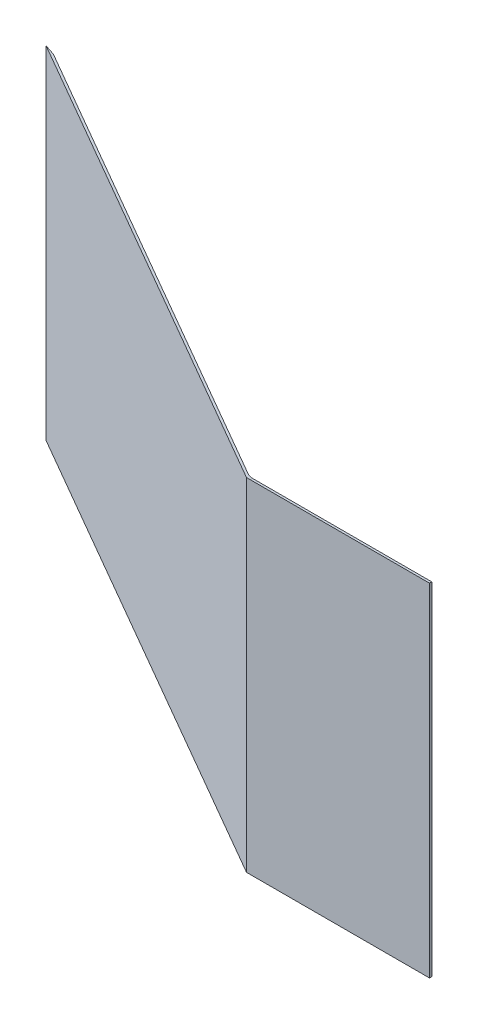
ISO-10303-21;
HEADER;
FILE_DESCRIPTION(('STEP AP214'),'2;1');
FILE_NAME('part.step','',(''),(''),'','','');
FILE_SCHEMA(('AUTOMOTIVE_DESIGN { 1 0 10303 214 1 1 1 1 }'));
ENDSEC;
DATA;
#1=APPLICATION_CONTEXT('core data for automotive mechanical design processes');
#2=APPLICATION_PROTOCOL_DEFINITION('international standard','automotive_design',2000,#1);
#3=PRODUCT_CONTEXT('',#1,'mechanical');
#4=PRODUCT('Part','Part','',(#3));
#5=PRODUCT_RELATED_PRODUCT_CATEGORY('part','',(#4));
#6=PRODUCT_DEFINITION_FORMATION('','',#4);
#7=PRODUCT_DEFINITION_CONTEXT('part definition',#1,'design');
#8=PRODUCT_DEFINITION('design','',#6,#7);
#9=PRODUCT_DEFINITION_SHAPE('','',#8);
#10=(LENGTH_UNIT() NAMED_UNIT(*) SI_UNIT(.MILLI.,.METRE.));
#11=(NAMED_UNIT(*) PLANE_ANGLE_UNIT() SI_UNIT($,.RADIAN.));
#12=(NAMED_UNIT(*) SI_UNIT($,.STERADIAN.) SOLID_ANGLE_UNIT());
#13=UNCERTAINTY_MEASURE_WITH_UNIT(LENGTH_MEASURE(1.E-05),#10,'distance_accuracy_value','');
#14=(GEOMETRIC_REPRESENTATION_CONTEXT(3) GLOBAL_UNCERTAINTY_ASSIGNED_CONTEXT((#13)) GLOBAL_UNIT_ASSIGNED_CONTEXT((#10,
#11,#12)) REPRESENTATION_CONTEXT('',''));
#15=CARTESIAN_POINT('',(0.,0.,0.));
#16=DIRECTION('',(0.,0.,1.));
#17=DIRECTION('',(1.,0.,0.));
#18=AXIS2_PLACEMENT_3D('',#15,#16,#17);
#19=CARTESIAN_POINT('',(118.585450177388,10.,41.1577708137846));
#20=DIRECTION('',(0.,0.,1.));
#21=DIRECTION('',(1.,0.,0.));
#22=AXIS2_PLACEMENT_3D('',#19,#20,#21);
#23=PLANE('',#22);
#24=DIRECTION('',(-1.,0.,0.));
#25=VECTOR('',#24,1.);
#26=CARTESIAN_POINT('',(118.585450177388,0.,41.1577708137846));
#27=LINE('',#26,#25);
#28=CARTESIAN_POINT('',(198.585450177388,0.,41.1577708137846));
#29=VERTEX_POINT('',#28);
#30=CARTESIAN_POINT('',(119.925196139544,0.,41.1577708137846));
#31=VERTEX_POINT('',#30);
#32=EDGE_CURVE('E133',#29,#31,#27,.T.);
#33=ORIENTED_EDGE('',*,*,#32,.T.);
#34=DIRECTION('',(0.,-1.,0.));
#35=VECTOR('',#34,1.);
#36=CARTESIAN_POINT('',(119.925196139544,150.,41.1577708137846));
#37=LINE('',#36,#35);
#38=CARTESIAN_POINT('',(119.925196139544,150.,41.1577708137846));
#39=VERTEX_POINT('',#38);
#40=EDGE_CURVE('E49',#31,#39,#37,.F.);
#41=ORIENTED_EDGE('',*,*,#40,.T.);
#42=DIRECTION('',(-1.,0.,0.));
#43=VECTOR('',#42,1.);
#44=CARTESIAN_POINT('',(118.585450177388,150.,41.1577708137846));
#45=LINE('',#44,#43);
#46=CARTESIAN_POINT('',(198.585450177388,150.,41.1577708137846));
#47=VERTEX_POINT('',#46);
#48=EDGE_CURVE('E275',#47,#39,#45,.T.);
#49=ORIENTED_EDGE('',*,*,#48,.F.);
#50=DIRECTION('',(0.,-1.,0.));
#51=VECTOR('',#50,1.);
#52=CARTESIAN_POINT('',(198.585450177388,10.,41.1577708137846));
#53=LINE('',#52,#51);
#54=EDGE_CURVE('E144',#47,#29,#53,.T.);
#55=ORIENTED_EDGE('',*,*,#54,.T.);
#56=EDGE_LOOP('',(#33,#41,#49,#55));
#57=FACE_BOUND('',#56,.T.);
#58=ADVANCED_FACE('F34',(#57),#23,.F.);
#59=CARTESIAN_POINT('',(-84.9305197119548,10.,-76.3422291862157));
#60=DIRECTION('',(-0.500000000000001,0.,0.866025403784438));
#61=DIRECTION('',(0.866025403784438,0.,0.500000000000001));
#62=AXIS2_PLACEMENT_3D('',#59,#60,#61);
#63=PLANE('',#62);
#64=DIRECTION('',(-0.866025403784438,0.,-0.500000000000001));
#65=VECTOR('',#64,1.);
#66=CARTESIAN_POINT('',(-84.9305197119548,150.,-76.3422291862157));
#67=LINE('',#66,#65);
#68=CARTESIAN_POINT('',(117.425196139544,150.,40.4878978327068));
#69=VERTEX_POINT('',#68);
#70=CARTESIAN_POINT('',(-84.4779851204287,150.,-76.0809582179805));
#71=VERTEX_POINT('',#70);
#72=EDGE_CURVE('E111',#69,#71,#67,.T.);
#73=ORIENTED_EDGE('',*,*,#72,.F.);
#74=DIRECTION('',(0.,-1.,0.));
#75=VECTOR('',#74,1.);
#76=CARTESIAN_POINT('',(117.425196139544,0.,40.4878978327068));
#77=LINE('',#76,#75);
#78=CARTESIAN_POINT('',(117.425196139544,0.,40.4878978327068));
#79=VERTEX_POINT('',#78);
#80=EDGE_CURVE('E159',#69,#79,#77,.T.);
#81=ORIENTED_EDGE('',*,*,#80,.T.);
#82=DIRECTION('',(-0.866025403784438,0.,-0.500000000000001));
#83=VECTOR('',#82,1.);
#84=CARTESIAN_POINT('',(-84.9305197119548,0.,-76.3422291862157));
#85=LINE('',#84,#83);
#86=CARTESIAN_POINT('',(-84.4779851204287,0.,-76.0809582179805));
#87=VERTEX_POINT('',#86);
#88=EDGE_CURVE('E135',#79,#87,#85,.T.);
#89=ORIENTED_EDGE('',*,*,#88,.T.);
#90=DIRECTION('',(0.,-1.,0.));
#91=VECTOR('',#90,1.);
#92=CARTESIAN_POINT('',(-84.4779851204287,10.,-76.0809582179805));
#93=LINE('',#92,#91);
#94=EDGE_CURVE('E155',#87,#71,#93,.F.);
#95=ORIENTED_EDGE('',*,*,#94,.T.);
#96=EDGE_LOOP('',(#73,#81,#89,#95));
#97=FACE_BOUND('',#96,.T.);
#98=ADVANCED_FACE('F165',(#97),#63,.F.);
#99=CARTESIAN_POINT('',(-89.5285959233081,10.,-77.8422291862156));
#100=DIRECTION('',(-0.310137835507767,0.,0.950691602459261));
#101=DIRECTION('',(0.950691602459261,0.,0.310137835507767));
#102=AXIS2_PLACEMENT_3D('',#99,#100,#101);
#103=PLANE('',#102);
#104=DIRECTION('',(-0.950691602459261,0.,-0.310137835507767));
#105=VECTOR('',#104,1.);
#106=CARTESIAN_POINT('',(-89.5285959233081,150.,-77.8422291862156));
#107=LINE('',#106,#105);
#108=CARTESIAN_POINT('',(-85.4272959428899,150.,-76.5042892113546));
#109=VERTEX_POINT('',#108);
#110=CARTESIAN_POINT('',(-89.5285959233081,150.,-77.8422291862156));
#111=VERTEX_POINT('',#110);
#112=EDGE_CURVE('E99',#109,#111,#107,.T.);
#113=ORIENTED_EDGE('',*,*,#112,.F.);
#114=DIRECTION('',(0.,-1.,0.));
#115=VECTOR('',#114,1.);
#116=CARTESIAN_POINT('',(-85.4272959428899,10.,-76.5042892113546));
#117=LINE('',#116,#115);
#118=CARTESIAN_POINT('',(-85.4272959428899,0.,-76.5042892113546));
#119=VERTEX_POINT('',#118);
#120=EDGE_CURVE('E120',#109,#119,#117,.T.);
#121=ORIENTED_EDGE('',*,*,#120,.T.);
#122=DIRECTION('',(-0.950691602459261,0.,-0.310137835507767));
#123=VECTOR('',#122,1.);
#124=CARTESIAN_POINT('',(-89.5285959233081,0.,-77.8422291862156));
#125=LINE('',#124,#123);
#126=CARTESIAN_POINT('',(-89.5285959233081,0.,-77.8422291862156));
#127=VERTEX_POINT('',#126);
#128=EDGE_CURVE('E117',#119,#127,#125,.T.);
#129=ORIENTED_EDGE('',*,*,#128,.T.);
#130=DIRECTION('',(0.,-1.,0.));
#131=VECTOR('',#130,1.);
#132=CARTESIAN_POINT('',(-89.5285959233081,10.,-77.8422291862156));
#133=LINE('',#132,#131);
#134=EDGE_CURVE('E114',#111,#127,#133,.T.);
#135=ORIENTED_EDGE('',*,*,#134,.F.);
#136=EDGE_LOOP('',(#113,#121,#129,#135));
#137=FACE_BOUND('',#136,.T.);
#138=ADVANCED_FACE('F115',(#137),#103,.F.);
#139=CARTESIAN_POINT('',(-89.5285959233081,10.,-77.8422291862156));
#140=DIRECTION('',(0.500000000000001,0.,-0.866025403784438));
#141=DIRECTION('',(-0.866025403784438,0.,-0.500000000000001));
#142=AXIS2_PLACEMENT_3D('',#139,#140,#141);
#143=PLANE('',#142);
#144=DIRECTION('',(0.866025403784438,0.,0.500000000000001));
#145=VECTOR('',#144,1.);
#146=CARTESIAN_POINT('',(-89.5285959233081,0.,-77.8422291862156));
#147=LINE('',#146,#145);
#148=CARTESIAN_POINT('',(118.317500984957,0.,42.1577708137846));
#149=VERTEX_POINT('',#148);
#150=EDGE_CURVE('E138',#127,#149,#147,.T.);
#151=ORIENTED_EDGE('',*,*,#150,.T.);
#152=DIRECTION('',(0.,-1.,0.));
#153=VECTOR('',#152,1.);
#154=CARTESIAN_POINT('',(118.317500984957,10.,42.1577708137846));
#155=LINE('',#154,#153);
#156=CARTESIAN_POINT('',(118.317500984957,150.,42.1577708137846));
#157=VERTEX_POINT('',#156);
#158=EDGE_CURVE('E121',#157,#149,#155,.T.);
#159=ORIENTED_EDGE('',*,*,#158,.F.);
#160=DIRECTION('',(0.866025403784438,0.,0.500000000000001));
#161=VECTOR('',#160,1.);
#162=CARTESIAN_POINT('',(-89.5285959233081,150.,-77.8422291862156));
#163=LINE('',#162,#161);
#164=EDGE_CURVE('E104',#111,#157,#163,.T.);
#165=ORIENTED_EDGE('',*,*,#164,.F.);
#166=ORIENTED_EDGE('',*,*,#134,.T.);
#167=EDGE_LOOP('',(#151,#159,#165,#166));
#168=FACE_BOUND('',#167,.T.);
#169=ADVANCED_FACE('F123',(#168),#143,.F.);
#170=CARTESIAN_POINT('',(118.317500984957,10.,42.1577708137846));
#171=DIRECTION('',(0.,0.,-1.));
#172=DIRECTION('',(-1.,0.,0.));
#173=AXIS2_PLACEMENT_3D('',#170,#171,#172);
#174=PLANE('',#173);
#175=DIRECTION('',(1.,0.,0.));
#176=VECTOR('',#175,1.);
#177=CARTESIAN_POINT('',(118.317500984957,0.,42.1577708137846));
#178=LINE('',#177,#176);
#179=CARTESIAN_POINT('',(198.585450177388,0.,42.1577708137846));
#180=VERTEX_POINT('',#179);
#181=EDGE_CURVE('E140',#149,#180,#178,.T.);
#182=ORIENTED_EDGE('',*,*,#181,.T.);
#183=DIRECTION('',(0.,-1.,0.));
#184=VECTOR('',#183,1.);
#185=CARTESIAN_POINT('',(198.585450177388,10.,42.1577708137846));
#186=LINE('',#185,#184);
#187=CARTESIAN_POINT('',(198.585450177388,150.,42.1577708137846));
#188=VERTEX_POINT('',#187);
#189=EDGE_CURVE('E147',#188,#180,#186,.T.);
#190=ORIENTED_EDGE('',*,*,#189,.F.);
#191=DIRECTION('',(1.,0.,0.));
#192=VECTOR('',#191,1.);
#193=CARTESIAN_POINT('',(118.317500984957,150.,42.1577708137846));
#194=LINE('',#193,#192);
#195=EDGE_CURVE('E125',#157,#188,#194,.T.);
#196=ORIENTED_EDGE('',*,*,#195,.F.);
#197=ORIENTED_EDGE('',*,*,#158,.T.);
#198=EDGE_LOOP('',(#182,#190,#196,#197));
#199=FACE_BOUND('',#198,.T.);
#200=ADVANCED_FACE('F189',(#199),#174,.F.);
#201=CARTESIAN_POINT('',(198.585450177388,10.,41.1577708137846));
#202=DIRECTION('',(-1.,0.,0.));
#203=DIRECTION('',(0.,0.,1.));
#204=AXIS2_PLACEMENT_3D('',#201,#202,#203);
#205=PLANE('',#204);
#206=DIRECTION('',(0.,0.,-1.));
#207=VECTOR('',#206,1.);
#208=CARTESIAN_POINT('',(198.585450177388,0.,41.1577708137846));
#209=LINE('',#208,#207);
#210=EDGE_CURVE('E142',#180,#29,#209,.T.);
#211=ORIENTED_EDGE('',*,*,#210,.T.);
#212=ORIENTED_EDGE('',*,*,#54,.F.);
#213=DIRECTION('',(0.,0.,-1.));
#214=VECTOR('',#213,1.);
#215=CARTESIAN_POINT('',(198.585450177388,150.,41.1577708137846));
#216=LINE('',#215,#214);
#217=EDGE_CURVE('E127',#188,#47,#216,.T.);
#218=ORIENTED_EDGE('',*,*,#217,.F.);
#219=ORIENTED_EDGE('',*,*,#189,.T.);
#220=EDGE_LOOP('',(#211,#212,#218,#219));
#221=FACE_BOUND('',#220,.T.);
#222=ADVANCED_FACE('F192',(#221),#205,.F.);
#223=CARTESIAN_POINT('',(0.,0.,0.));
#224=DIRECTION('',(0.,-1.,0.));
#225=DIRECTION('',(0.,0.,-1.));
#226=AXIS2_PLACEMENT_3D('',#223,#224,#225);
#227=PLANE('',#226);
#228=ORIENTED_EDGE('',*,*,#128,.F.);
#229=CARTESIAN_POINT('',(-86.9779851204287,0.,-71.7508311990583));
#230=DIRECTION('',(0.,-1.,0.));
#231=DIRECTION('',(0.,0.,-1.));
#232=AXIS2_PLACEMENT_3D('',#229,#230,#231);
#233=CIRCLE('',#232,5.);
#234=EDGE_CURVE('E152',#119,#87,#233,.T.);
#235=ORIENTED_EDGE('',*,*,#234,.T.);
#236=ORIENTED_EDGE('',*,*,#88,.F.);
#237=CARTESIAN_POINT('',(119.925196139544,0.,36.1577708137846));
#238=DIRECTION('',(0.,-1.,0.));
#239=DIRECTION('',(0.,0.,-1.));
#240=AXIS2_PLACEMENT_3D('',#237,#238,#239);
#241=CIRCLE('',#240,5.);
#242=EDGE_CURVE('E42',#79,#31,#241,.F.);
#243=ORIENTED_EDGE('',*,*,#242,.T.);
#244=ORIENTED_EDGE('',*,*,#32,.F.);
#245=ORIENTED_EDGE('',*,*,#210,.F.);
#246=ORIENTED_EDGE('',*,*,#181,.F.);
#247=ORIENTED_EDGE('',*,*,#150,.F.);
#248=EDGE_LOOP('',(#228,#235,#236,#243,#244,#245,#246,#247));
#249=FACE_BOUND('',#248,.T.);
#250=ADVANCED_FACE('F168',(#249),#227,.T.);
#251=CARTESIAN_POINT('',(0.,150.,0.));
#252=DIRECTION('',(0.,-1.,0.));
#253=DIRECTION('',(0.,0.,-1.));
#254=AXIS2_PLACEMENT_3D('',#251,#252,#253);
#255=PLANE('',#254);
#256=ORIENTED_EDGE('',*,*,#48,.T.);
#257=CARTESIAN_POINT('',(119.925196139544,150.,36.1577708137846));
#258=DIRECTION('',(0.,-1.,0.));
#259=DIRECTION('',(0.,0.,-1.));
#260=AXIS2_PLACEMENT_3D('',#257,#258,#259);
#261=CIRCLE('',#260,5.);
#262=EDGE_CURVE('E11',#39,#69,#261,.T.);
#263=ORIENTED_EDGE('',*,*,#262,.T.);
#264=ORIENTED_EDGE('',*,*,#72,.T.);
#265=CARTESIAN_POINT('',(-86.9779851204287,150.,-71.7508311990583));
#266=DIRECTION('',(0.,-1.,0.));
#267=DIRECTION('',(0.,0.,-1.));
#268=AXIS2_PLACEMENT_3D('',#265,#266,#267);
#269=CIRCLE('',#268,5.);
#270=EDGE_CURVE('E107',#71,#109,#269,.F.);
#271=ORIENTED_EDGE('',*,*,#270,.T.);
#272=ORIENTED_EDGE('',*,*,#112,.T.);
#273=ORIENTED_EDGE('',*,*,#164,.T.);
#274=ORIENTED_EDGE('',*,*,#195,.T.);
#275=ORIENTED_EDGE('',*,*,#217,.T.);
#276=EDGE_LOOP('',(#256,#263,#264,#271,#272,#273,#274,#275));
#277=FACE_BOUND('',#276,.T.);
#278=ADVANCED_FACE('F101',(#277),#255,.F.);
#279=CARTESIAN_POINT('',(-86.9779851204287,10.,-71.7508311990583));
#280=DIRECTION('',(0.,-1.,0.));
#281=DIRECTION('',(0.,0.,-1.));
#282=AXIS2_PLACEMENT_3D('',#279,#280,#281);
#283=CYLINDRICAL_SURFACE('',#282,5.);
#284=ORIENTED_EDGE('',*,*,#270,.F.);
#285=ORIENTED_EDGE('',*,*,#94,.F.);
#286=ORIENTED_EDGE('',*,*,#234,.F.);
#287=ORIENTED_EDGE('',*,*,#120,.F.);
#288=EDGE_LOOP('',(#284,#285,#286,#287));
#289=FACE_BOUND('',#288,.T.);
#290=ADVANCED_FACE('F171',(#289),#283,.T.);
#291=CARTESIAN_POINT('',(119.925196139544,10.,36.1577708137846));
#292=DIRECTION('',(0.,1.,0.));
#293=DIRECTION('',(0.,0.,1.));
#294=AXIS2_PLACEMENT_3D('',#291,#292,#293);
#295=CYLINDRICAL_SURFACE('',#294,5.);
#296=ORIENTED_EDGE('',*,*,#262,.F.);
#297=ORIENTED_EDGE('',*,*,#40,.F.);
#298=ORIENTED_EDGE('',*,*,#242,.F.);
#299=ORIENTED_EDGE('',*,*,#80,.F.);
#300=EDGE_LOOP('',(#296,#297,#298,#299));
#301=FACE_BOUND('',#300,.T.);
#302=ADVANCED_FACE('F36',(#301),#295,.F.);
#303=CLOSED_SHELL('',(#58,#98,#138,#169,#200,#222,#250,#278,#290,#302));
#304=MANIFOLD_SOLID_BREP('B2',#303);
#305=ADVANCED_BREP_SHAPE_REPRESENTATION('',(#18,#304),#14);
#306=SHAPE_DEFINITION_REPRESENTATION(#9,#305);
ENDSEC;
END-ISO-10303-21;
